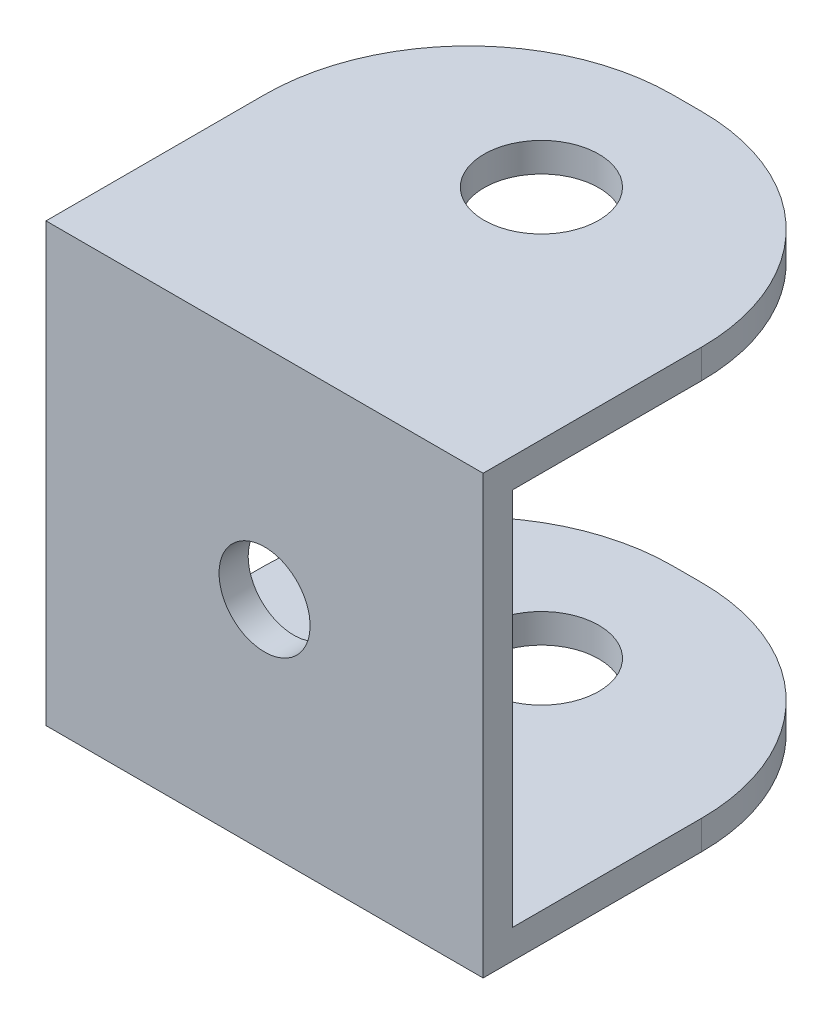
ISO-10303-21;
HEADER;
FILE_DESCRIPTION(('STEP AP214'),'2;1');
FILE_NAME('part.step','',(''),(''),'','','');
FILE_SCHEMA(('AUTOMOTIVE_DESIGN { 1 0 10303 214 1 1 1 1 }'));
ENDSEC;
DATA;
#1=APPLICATION_CONTEXT('core data for automotive mechanical design processes');
#2=APPLICATION_PROTOCOL_DEFINITION('international standard','automotive_design',2000,#1);
#3=PRODUCT_CONTEXT('',#1,'mechanical');
#4=PRODUCT('Part','Part','',(#3));
#5=PRODUCT_RELATED_PRODUCT_CATEGORY('part','',(#4));
#6=PRODUCT_DEFINITION_FORMATION('','',#4);
#7=PRODUCT_DEFINITION_CONTEXT('part definition',#1,'design');
#8=PRODUCT_DEFINITION('design','',#6,#7);
#9=PRODUCT_DEFINITION_SHAPE('','',#8);
#10=(LENGTH_UNIT() NAMED_UNIT(*) SI_UNIT(.MILLI.,.METRE.));
#11=(NAMED_UNIT(*) PLANE_ANGLE_UNIT() SI_UNIT($,.RADIAN.));
#12=(NAMED_UNIT(*) SI_UNIT($,.STERADIAN.) SOLID_ANGLE_UNIT());
#13=UNCERTAINTY_MEASURE_WITH_UNIT(LENGTH_MEASURE(1.E-05),#10,'distance_accuracy_value','');
#14=(GEOMETRIC_REPRESENTATION_CONTEXT(3) GLOBAL_UNCERTAINTY_ASSIGNED_CONTEXT((#13)) GLOBAL_UNIT_ASSIGNED_CONTEXT((#10,
#11,#12)) REPRESENTATION_CONTEXT('',''));
#15=CARTESIAN_POINT('',(0.,0.,0.));
#16=DIRECTION('',(0.,0.,1.));
#17=DIRECTION('',(1.,0.,0.));
#18=AXIS2_PLACEMENT_3D('',#15,#16,#17);
#19=CARTESIAN_POINT('',(0.,0.,0.));
#20=DIRECTION('',(0.,0.,-1.));
#21=DIRECTION('',(-1.,0.,0.));
#22=AXIS2_PLACEMENT_3D('',#19,#20,#21);
#23=PLANE('',#22);
#24=CARTESIAN_POINT('',(19.05,19.05,0.));
#25=DIRECTION('',(0.,0.,-1.));
#26=DIRECTION('',(-1.,0.,0.));
#27=AXIS2_PLACEMENT_3D('',#24,#25,#26);
#28=CIRCLE('',#27,3.96874999999999);
#29=CARTESIAN_POINT('',(15.08125,19.05,0.));
#30=VERTEX_POINT('',#29);
#31=EDGE_CURVE('E178',#30,#30,#28,.T.);
#32=ORIENTED_EDGE('',*,*,#31,.F.);
#33=EDGE_LOOP('',(#32));
#34=FACE_BOUND('',#33,.T.);
#35=DIRECTION('',(0.,1.,0.));
#36=VECTOR('',#35,1.);
#37=CARTESIAN_POINT('',(38.1,0.,0.));
#38=LINE('',#37,#36);
#39=CARTESIAN_POINT('',(38.1,2.54,0.));
#40=VERTEX_POINT('',#39);
#41=CARTESIAN_POINT('',(38.1,35.56,0.));
#42=VERTEX_POINT('',#41);
#43=EDGE_CURVE('E240',#40,#42,#38,.T.);
#44=ORIENTED_EDGE('',*,*,#43,.F.);
#45=DIRECTION('',(-1.,0.,0.));
#46=VECTOR('',#45,1.);
#47=CARTESIAN_POINT('',(0.,2.54,0.));
#48=LINE('',#47,#46);
#49=CARTESIAN_POINT('',(0.,2.54,0.));
#50=VERTEX_POINT('',#49);
#51=EDGE_CURVE('E175',#40,#50,#48,.T.);
#52=ORIENTED_EDGE('',*,*,#51,.T.);
#53=DIRECTION('',(0.,-1.,0.));
#54=VECTOR('',#53,1.);
#55=CARTESIAN_POINT('',(0.,0.,0.));
#56=LINE('',#55,#54);
#57=CARTESIAN_POINT('',(0.,35.56,0.));
#58=VERTEX_POINT('',#57);
#59=EDGE_CURVE('E143',#58,#50,#56,.T.);
#60=ORIENTED_EDGE('',*,*,#59,.F.);
#61=DIRECTION('',(1.,0.,0.));
#62=VECTOR('',#61,1.);
#63=CARTESIAN_POINT('',(0.,35.56,0.));
#64=LINE('',#63,#62);
#65=EDGE_CURVE('E11',#58,#42,#64,.T.);
#66=ORIENTED_EDGE('',*,*,#65,.T.);
#67=EDGE_LOOP('',(#44,#52,#60,#66));
#68=FACE_BOUND('',#67,.T.);
#69=ADVANCED_FACE('F45',(#34,#68),#23,.T.);
#70=CARTESIAN_POINT('',(0.,0.,2.54));
#71=DIRECTION('',(1.,0.,0.));
#72=DIRECTION('',(0.,1.,0.));
#73=AXIS2_PLACEMENT_3D('',#70,#71,#72);
#74=PLANE('',#73);
#75=DIRECTION('',(0.,0.,-1.));
#76=VECTOR('',#75,1.);
#77=CARTESIAN_POINT('',(0.,0.,2.54));
#78=LINE('',#77,#76);
#79=CARTESIAN_POINT('',(0.,0.,2.54));
#80=VERTEX_POINT('',#79);
#81=CARTESIAN_POINT('',(0.,0.,-16.5099999999999));
#82=VERTEX_POINT('',#81);
#83=EDGE_CURVE('E55',#80,#82,#78,.T.);
#84=ORIENTED_EDGE('',*,*,#83,.F.);
#85=DIRECTION('',(0.,-1.,0.));
#86=VECTOR('',#85,1.);
#87=CARTESIAN_POINT('',(0.,0.,2.54));
#88=LINE('',#87,#86);
#89=CARTESIAN_POINT('',(0.,38.1,2.54));
#90=VERTEX_POINT('',#89);
#91=EDGE_CURVE('E236',#90,#80,#88,.T.);
#92=ORIENTED_EDGE('',*,*,#91,.F.);
#93=DIRECTION('',(0.,0.,-1.));
#94=VECTOR('',#93,1.);
#95=CARTESIAN_POINT('',(0.,38.1,2.54));
#96=LINE('',#95,#94);
#97=CARTESIAN_POINT('',(0.,38.1,-16.5099999999999));
#98=VERTEX_POINT('',#97);
#99=EDGE_CURVE('E247',#90,#98,#96,.T.);
#100=ORIENTED_EDGE('',*,*,#99,.T.);
#101=DIRECTION('',(0.,1.,0.));
#102=VECTOR('',#101,1.);
#103=CARTESIAN_POINT('',(0.,35.56,-16.5099999999999));
#104=LINE('',#103,#102);
#105=CARTESIAN_POINT('',(0.,35.56,-16.5099999999999));
#106=VERTEX_POINT('',#105);
#107=EDGE_CURVE('E223',#106,#98,#104,.T.);
#108=ORIENTED_EDGE('',*,*,#107,.F.);
#109=DIRECTION('',(0.,0.,1.));
#110=VECTOR('',#109,1.);
#111=CARTESIAN_POINT('',(0.,35.56,0.));
#112=LINE('',#111,#110);
#113=EDGE_CURVE('E192',#106,#58,#112,.T.);
#114=ORIENTED_EDGE('',*,*,#113,.T.);
#115=ORIENTED_EDGE('',*,*,#59,.T.);
#116=DIRECTION('',(0.,0.,1.));
#117=VECTOR('',#116,1.);
#118=CARTESIAN_POINT('',(0.,2.54,0.));
#119=LINE('',#118,#117);
#120=CARTESIAN_POINT('',(0.,2.54,-16.5099999999999));
#121=VERTEX_POINT('',#120);
#122=EDGE_CURVE('E136',#121,#50,#119,.T.);
#123=ORIENTED_EDGE('',*,*,#122,.F.);
#124=DIRECTION('',(0.,-1.,0.));
#125=VECTOR('',#124,1.);
#126=CARTESIAN_POINT('',(0.,2.54,-16.5099999999999));
#127=LINE('',#126,#125);
#128=EDGE_CURVE('E140',#121,#82,#127,.T.);
#129=ORIENTED_EDGE('',*,*,#128,.T.);
#130=EDGE_LOOP('',(#84,#92,#100,#108,#114,#115,#123,#129));
#131=FACE_BOUND('',#130,.T.);
#132=ADVANCED_FACE('F47',(#131),#74,.F.);
#133=CARTESIAN_POINT('',(0.,0.,2.54));
#134=DIRECTION('',(0.,1.,0.));
#135=DIRECTION('',(0.,0.,1.));
#136=AXIS2_PLACEMENT_3D('',#133,#134,#135);
#137=PLANE('',#136);
#138=CARTESIAN_POINT('',(19.05,0.,-21.59));
#139=DIRECTION('',(0.,-1.,0.));
#140=DIRECTION('',(0.,0.,-1.));
#141=AXIS2_PLACEMENT_3D('',#138,#139,#140);
#142=CIRCLE('',#141,5.);
#143=CARTESIAN_POINT('',(19.05,0.,-26.59));
#144=VERTEX_POINT('',#143);
#145=EDGE_CURVE('E309',#144,#144,#142,.T.);
#146=ORIENTED_EDGE('',*,*,#145,.F.);
#147=EDGE_LOOP('',(#146));
#148=FACE_BOUND('',#147,.T.);
#149=ORIENTED_EDGE('',*,*,#83,.T.);
#150=CARTESIAN_POINT('',(17.78,0.,-16.51));
#151=DIRECTION('',(0.,1.,0.));
#152=DIRECTION('',(0.,0.,-1.));
#153=AXIS2_PLACEMENT_3D('',#150,#151,#152);
#154=CIRCLE('',#153,17.78);
#155=CARTESIAN_POINT('',(17.78,0.,-34.29));
#156=VERTEX_POINT('',#155);
#157=EDGE_CURVE('E162',#156,#82,#154,.T.);
#158=ORIENTED_EDGE('',*,*,#157,.F.);
#159=DIRECTION('',(-1.,0.,0.));
#160=VECTOR('',#159,1.);
#161=CARTESIAN_POINT('',(20.3199999999999,0.,-34.29));
#162=LINE('',#161,#160);
#163=CARTESIAN_POINT('',(20.3199999999999,0.,-34.29));
#164=VERTEX_POINT('',#163);
#165=EDGE_CURVE('E343',#164,#156,#162,.T.);
#166=ORIENTED_EDGE('',*,*,#165,.F.);
#167=CARTESIAN_POINT('',(20.32,0.,-16.51));
#168=DIRECTION('',(0.,1.,0.));
#169=DIRECTION('',(0.,0.,1.));
#170=AXIS2_PLACEMENT_3D('',#167,#168,#169);
#171=CIRCLE('',#170,17.78);
#172=CARTESIAN_POINT('',(38.1,0.,-16.5099999999999));
#173=VERTEX_POINT('',#172);
#174=EDGE_CURVE('E148',#173,#164,#171,.T.);
#175=ORIENTED_EDGE('',*,*,#174,.F.);
#176=DIRECTION('',(0.,0.,-1.));
#177=VECTOR('',#176,1.);
#178=CARTESIAN_POINT('',(38.1,0.,2.54));
#179=LINE('',#178,#177);
#180=CARTESIAN_POINT('',(38.1,0.,2.54));
#181=VERTEX_POINT('',#180);
#182=EDGE_CURVE('E257',#181,#173,#179,.T.);
#183=ORIENTED_EDGE('',*,*,#182,.F.);
#184=DIRECTION('',(1.,0.,0.));
#185=VECTOR('',#184,1.);
#186=CARTESIAN_POINT('',(0.,0.,2.54));
#187=LINE('',#186,#185);
#188=EDGE_CURVE('E239',#80,#181,#187,.T.);
#189=ORIENTED_EDGE('',*,*,#188,.F.);
#190=EDGE_LOOP('',(#149,#158,#166,#175,#183,#189));
#191=FACE_BOUND('',#190,.T.);
#192=ADVANCED_FACE('F288',(#148,#191),#137,.F.);
#193=CARTESIAN_POINT('',(38.1,0.,2.54));
#194=DIRECTION('',(-1.,0.,0.));
#195=DIRECTION('',(0.,-1.,0.));
#196=AXIS2_PLACEMENT_3D('',#193,#194,#195);
#197=PLANE('',#196);
#198=ORIENTED_EDGE('',*,*,#182,.T.);
#199=DIRECTION('',(0.,-1.,0.));
#200=VECTOR('',#199,1.);
#201=CARTESIAN_POINT('',(38.1,2.54,-16.5099999999999));
#202=LINE('',#201,#200);
#203=CARTESIAN_POINT('',(38.1,2.54,-16.5099999999999));
#204=VERTEX_POINT('',#203);
#205=EDGE_CURVE('E179',#204,#173,#202,.T.);
#206=ORIENTED_EDGE('',*,*,#205,.F.);
#207=DIRECTION('',(0.,0.,-1.));
#208=VECTOR('',#207,1.);
#209=CARTESIAN_POINT('',(38.1,2.54,0.));
#210=LINE('',#209,#208);
#211=EDGE_CURVE('E165',#40,#204,#210,.T.);
#212=ORIENTED_EDGE('',*,*,#211,.F.);
#213=ORIENTED_EDGE('',*,*,#43,.T.);
#214=DIRECTION('',(0.,0.,-1.));
#215=VECTOR('',#214,1.);
#216=CARTESIAN_POINT('',(38.1,35.56,2.54));
#217=LINE('',#216,#215);
#218=CARTESIAN_POINT('',(38.1,35.56,-16.5099999999999));
#219=VERTEX_POINT('',#218);
#220=EDGE_CURVE('E195',#42,#219,#217,.T.);
#221=ORIENTED_EDGE('',*,*,#220,.T.);
#222=DIRECTION('',(0.,1.,0.));
#223=VECTOR('',#222,1.);
#224=CARTESIAN_POINT('',(38.1,35.56,-16.5099999999999));
#225=LINE('',#224,#223);
#226=CARTESIAN_POINT('',(38.1,38.1,-16.5099999999999));
#227=VERTEX_POINT('',#226);
#228=EDGE_CURVE('E211',#219,#227,#225,.T.);
#229=ORIENTED_EDGE('',*,*,#228,.T.);
#230=DIRECTION('',(0.,0.,-1.));
#231=VECTOR('',#230,1.);
#232=CARTESIAN_POINT('',(38.1,38.1,2.54));
#233=LINE('',#232,#231);
#234=CARTESIAN_POINT('',(38.1,38.1,2.54));
#235=VERTEX_POINT('',#234);
#236=EDGE_CURVE('E254',#235,#227,#233,.T.);
#237=ORIENTED_EDGE('',*,*,#236,.F.);
#238=DIRECTION('',(0.,1.,0.));
#239=VECTOR('',#238,1.);
#240=CARTESIAN_POINT('',(38.1,0.,2.54));
#241=LINE('',#240,#239);
#242=EDGE_CURVE('E68',#181,#235,#241,.T.);
#243=ORIENTED_EDGE('',*,*,#242,.F.);
#244=EDGE_LOOP('',(#198,#206,#212,#213,#221,#229,#237,#243));
#245=FACE_BOUND('',#244,.T.);
#246=ADVANCED_FACE('F298',(#245),#197,.F.);
#247=CARTESIAN_POINT('',(0.,38.1,2.54));
#248=DIRECTION('',(0.,-1.,0.));
#249=DIRECTION('',(0.,0.,-1.));
#250=AXIS2_PLACEMENT_3D('',#247,#248,#249);
#251=PLANE('',#250);
#252=CARTESIAN_POINT('',(19.05,38.1,-21.59));
#253=DIRECTION('',(0.,1.,0.));
#254=DIRECTION('',(0.,0.,1.));
#255=AXIS2_PLACEMENT_3D('',#252,#253,#254);
#256=CIRCLE('',#255,5.);
#257=CARTESIAN_POINT('',(19.05,38.1,-16.59));
#258=VERTEX_POINT('',#257);
#259=EDGE_CURVE('E187',#258,#258,#256,.T.);
#260=ORIENTED_EDGE('',*,*,#259,.F.);
#261=EDGE_LOOP('',(#260));
#262=FACE_BOUND('',#261,.T.);
#263=CARTESIAN_POINT('',(17.78,38.1,-16.51));
#264=DIRECTION('',(0.,1.,0.));
#265=DIRECTION('',(0.,0.,-1.));
#266=AXIS2_PLACEMENT_3D('',#263,#264,#265);
#267=CIRCLE('',#266,17.78);
#268=CARTESIAN_POINT('',(17.78,38.1,-34.29));
#269=VERTEX_POINT('',#268);
#270=EDGE_CURVE('E196',#269,#98,#267,.T.);
#271=ORIENTED_EDGE('',*,*,#270,.T.);
#272=ORIENTED_EDGE('',*,*,#99,.F.);
#273=DIRECTION('',(-1.,0.,0.));
#274=VECTOR('',#273,1.);
#275=CARTESIAN_POINT('',(0.,38.1,2.54));
#276=LINE('',#275,#274);
#277=EDGE_CURVE('E63',#235,#90,#276,.T.);
#278=ORIENTED_EDGE('',*,*,#277,.F.);
#279=ORIENTED_EDGE('',*,*,#236,.T.);
#280=CARTESIAN_POINT('',(20.32,38.1,-16.51));
#281=DIRECTION('',(0.,1.,0.));
#282=DIRECTION('',(0.,0.,1.));
#283=AXIS2_PLACEMENT_3D('',#280,#281,#282);
#284=CIRCLE('',#283,17.78);
#285=CARTESIAN_POINT('',(20.3199999999999,38.1,-34.29));
#286=VERTEX_POINT('',#285);
#287=EDGE_CURVE('E212',#227,#286,#284,.T.);
#288=ORIENTED_EDGE('',*,*,#287,.T.);
#289=DIRECTION('',(-1.,0.,0.));
#290=VECTOR('',#289,1.);
#291=CARTESIAN_POINT('',(20.3199999999999,38.1,-34.29));
#292=LINE('',#291,#290);
#293=EDGE_CURVE('E216',#286,#269,#292,.T.);
#294=ORIENTED_EDGE('',*,*,#293,.T.);
#295=EDGE_LOOP('',(#271,#272,#278,#279,#288,#294));
#296=FACE_BOUND('',#295,.T.);
#297=ADVANCED_FACE('F295',(#262,#296),#251,.F.);
#298=CARTESIAN_POINT('',(0.,0.,2.54));
#299=DIRECTION('',(0.,0.,-1.));
#300=DIRECTION('',(-1.,0.,0.));
#301=AXIS2_PLACEMENT_3D('',#298,#299,#300);
#302=PLANE('',#301);
#303=ORIENTED_EDGE('',*,*,#242,.T.);
#304=ORIENTED_EDGE('',*,*,#277,.T.);
#305=ORIENTED_EDGE('',*,*,#91,.T.);
#306=ORIENTED_EDGE('',*,*,#188,.T.);
#307=EDGE_LOOP('',(#303,#304,#305,#306));
#308=FACE_BOUND('',#307,.T.);
#309=CARTESIAN_POINT('',(19.05,19.05,2.54));
#310=DIRECTION('',(0.,0.,-1.));
#311=DIRECTION('',(-1.,0.,0.));
#312=AXIS2_PLACEMENT_3D('',#309,#310,#311);
#313=CIRCLE('',#312,3.96875);
#314=CARTESIAN_POINT('',(15.08125,19.05,2.54));
#315=VERTEX_POINT('',#314);
#316=EDGE_CURVE('E183',#315,#315,#313,.T.);
#317=ORIENTED_EDGE('',*,*,#316,.T.);
#318=EDGE_LOOP('',(#317));
#319=FACE_BOUND('',#318,.T.);
#320=ADVANCED_FACE('F293',(#308,#319),#302,.F.);
#321=CARTESIAN_POINT('',(17.78,35.56,-16.51));
#322=DIRECTION('',(0.,1.,0.));
#323=DIRECTION('',(0.,0.,1.));
#324=AXIS2_PLACEMENT_3D('',#321,#322,#323);
#325=CYLINDRICAL_SURFACE('',#324,17.78);
#326=ORIENTED_EDGE('',*,*,#270,.F.);
#327=DIRECTION('',(0.,1.,0.));
#328=VECTOR('',#327,1.);
#329=CARTESIAN_POINT('',(17.78,35.56,-34.29));
#330=LINE('',#329,#328);
#331=CARTESIAN_POINT('',(17.78,35.56,-34.29));
#332=VERTEX_POINT('',#331);
#333=EDGE_CURVE('E227',#332,#269,#330,.T.);
#334=ORIENTED_EDGE('',*,*,#333,.F.);
#335=CARTESIAN_POINT('',(17.78,35.56,-16.51));
#336=DIRECTION('',(0.,1.,0.));
#337=DIRECTION('',(0.,0.,-1.));
#338=AXIS2_PLACEMENT_3D('',#335,#336,#337);
#339=CIRCLE('',#338,17.78);
#340=EDGE_CURVE('E207',#332,#106,#339,.T.);
#341=ORIENTED_EDGE('',*,*,#340,.T.);
#342=ORIENTED_EDGE('',*,*,#107,.T.);
#343=EDGE_LOOP('',(#326,#334,#341,#342));
#344=FACE_BOUND('',#343,.T.);
#345=ADVANCED_FACE('F325',(#344),#325,.T.);
#346=CARTESIAN_POINT('',(20.3199999999999,35.56,-34.29));
#347=DIRECTION('',(0.,0.,-1.));
#348=DIRECTION('',(-1.,0.,0.));
#349=AXIS2_PLACEMENT_3D('',#346,#347,#348);
#350=PLANE('',#349);
#351=ORIENTED_EDGE('',*,*,#293,.F.);
#352=DIRECTION('',(0.,1.,0.));
#353=VECTOR('',#352,1.);
#354=CARTESIAN_POINT('',(20.3199999999999,35.56,-34.29));
#355=LINE('',#354,#353);
#356=CARTESIAN_POINT('',(20.3199999999999,35.56,-34.29));
#357=VERTEX_POINT('',#356);
#358=EDGE_CURVE('E230',#357,#286,#355,.T.);
#359=ORIENTED_EDGE('',*,*,#358,.F.);
#360=DIRECTION('',(-1.,0.,0.));
#361=VECTOR('',#360,1.);
#362=CARTESIAN_POINT('',(20.3199999999999,35.56,-34.29));
#363=LINE('',#362,#361);
#364=EDGE_CURVE('E203',#357,#332,#363,.T.);
#365=ORIENTED_EDGE('',*,*,#364,.T.);
#366=ORIENTED_EDGE('',*,*,#333,.T.);
#367=EDGE_LOOP('',(#351,#359,#365,#366));
#368=FACE_BOUND('',#367,.T.);
#369=ADVANCED_FACE('F418',(#368),#350,.T.);
#370=CARTESIAN_POINT('',(20.32,35.56,-16.51));
#371=DIRECTION('',(0.,1.,0.));
#372=DIRECTION('',(0.,0.,1.));
#373=AXIS2_PLACEMENT_3D('',#370,#371,#372);
#374=CYLINDRICAL_SURFACE('',#373,17.78);
#375=ORIENTED_EDGE('',*,*,#287,.F.);
#376=ORIENTED_EDGE('',*,*,#228,.F.);
#377=CARTESIAN_POINT('',(20.32,35.56,-16.51));
#378=DIRECTION('',(0.,1.,0.));
#379=DIRECTION('',(0.,0.,1.));
#380=AXIS2_PLACEMENT_3D('',#377,#378,#379);
#381=CIRCLE('',#380,17.78);
#382=EDGE_CURVE('E199',#219,#357,#381,.T.);
#383=ORIENTED_EDGE('',*,*,#382,.T.);
#384=ORIENTED_EDGE('',*,*,#358,.T.);
#385=EDGE_LOOP('',(#375,#376,#383,#384));
#386=FACE_BOUND('',#385,.T.);
#387=ADVANCED_FACE('F280',(#386),#374,.T.);
#388=CARTESIAN_POINT('',(20.32,35.56,-16.51));
#389=DIRECTION('',(0.,1.,0.));
#390=DIRECTION('',(0.,0.,1.));
#391=AXIS2_PLACEMENT_3D('',#388,#389,#390);
#392=PLANE('',#391);
#393=CARTESIAN_POINT('',(19.05,35.56,-21.59));
#394=DIRECTION('',(0.,1.,0.));
#395=DIRECTION('',(0.,0.,1.));
#396=AXIS2_PLACEMENT_3D('',#393,#394,#395);
#397=CIRCLE('',#396,5.);
#398=CARTESIAN_POINT('',(19.05,35.56,-16.59));
#399=VERTEX_POINT('',#398);
#400=EDGE_CURVE('E191',#399,#399,#397,.T.);
#401=ORIENTED_EDGE('',*,*,#400,.T.);
#402=EDGE_LOOP('',(#401));
#403=FACE_BOUND('',#402,.T.);
#404=ORIENTED_EDGE('',*,*,#65,.F.);
#405=ORIENTED_EDGE('',*,*,#113,.F.);
#406=ORIENTED_EDGE('',*,*,#340,.F.);
#407=ORIENTED_EDGE('',*,*,#364,.F.);
#408=ORIENTED_EDGE('',*,*,#382,.F.);
#409=ORIENTED_EDGE('',*,*,#220,.F.);
#410=EDGE_LOOP('',(#404,#405,#406,#407,#408,#409));
#411=FACE_BOUND('',#410,.T.);
#412=ADVANCED_FACE('F265',(#403,#411),#392,.F.);
#413=CARTESIAN_POINT('',(19.05,38.1,-21.59));
#414=DIRECTION('',(0.,1.,0.));
#415=DIRECTION('',(0.,0.,1.));
#416=AXIS2_PLACEMENT_3D('',#413,#414,#415);
#417=CYLINDRICAL_SURFACE('',#416,5.);
#418=ORIENTED_EDGE('',*,*,#259,.T.);
#419=EDGE_LOOP('',(#418));
#420=FACE_BOUND('',#419,.T.);
#421=ORIENTED_EDGE('',*,*,#400,.F.);
#422=EDGE_LOOP('',(#421));
#423=FACE_BOUND('',#422,.T.);
#424=ADVANCED_FACE('F268',(#420,#423),#417,.F.);
#425=CARTESIAN_POINT('',(19.05,19.05,0.));
#426=DIRECTION('',(0.,0.,-1.));
#427=DIRECTION('',(-1.,0.,0.));
#428=AXIS2_PLACEMENT_3D('',#425,#426,#427);
#429=CYLINDRICAL_SURFACE('',#428,3.96874999999999);
#430=ORIENTED_EDGE('',*,*,#316,.F.);
#431=EDGE_LOOP('',(#430));
#432=FACE_BOUND('',#431,.T.);
#433=ORIENTED_EDGE('',*,*,#31,.T.);
#434=EDGE_LOOP('',(#433));
#435=FACE_BOUND('',#434,.T.);
#436=ADVANCED_FACE('F270',(#432,#435),#429,.F.);
#437=CARTESIAN_POINT('',(20.32,2.54,-16.51));
#438=DIRECTION('',(0.,-1.,0.));
#439=DIRECTION('',(0.,0.,-1.));
#440=AXIS2_PLACEMENT_3D('',#437,#438,#439);
#441=CYLINDRICAL_SURFACE('',#440,17.78);
#442=ORIENTED_EDGE('',*,*,#174,.T.);
#443=DIRECTION('',(0.,-1.,0.));
#444=VECTOR('',#443,1.);
#445=CARTESIAN_POINT('',(20.3199999999999,2.54,-34.29));
#446=LINE('',#445,#444);
#447=CARTESIAN_POINT('',(20.3199999999999,2.54,-34.29));
#448=VERTEX_POINT('',#447);
#449=EDGE_CURVE('E169',#448,#164,#446,.T.);
#450=ORIENTED_EDGE('',*,*,#449,.F.);
#451=CARTESIAN_POINT('',(20.32,2.54,-16.51));
#452=DIRECTION('',(0.,1.,0.));
#453=DIRECTION('',(0.,0.,1.));
#454=AXIS2_PLACEMENT_3D('',#451,#452,#453);
#455=CIRCLE('',#454,17.78);
#456=EDGE_CURVE('E171',#204,#448,#455,.T.);
#457=ORIENTED_EDGE('',*,*,#456,.F.);
#458=ORIENTED_EDGE('',*,*,#205,.T.);
#459=EDGE_LOOP('',(#442,#450,#457,#458));
#460=FACE_BOUND('',#459,.T.);
#461=ADVANCED_FACE('F277',(#460),#441,.T.);
#462=CARTESIAN_POINT('',(20.3199999999999,2.54,-34.29));
#463=DIRECTION('',(0.,0.,1.));
#464=DIRECTION('',(1.,0.,0.));
#465=AXIS2_PLACEMENT_3D('',#462,#463,#464);
#466=PLANE('',#465);
#467=ORIENTED_EDGE('',*,*,#165,.T.);
#468=DIRECTION('',(0.,-1.,0.));
#469=VECTOR('',#468,1.);
#470=CARTESIAN_POINT('',(17.78,2.54,-34.29));
#471=LINE('',#470,#469);
#472=CARTESIAN_POINT('',(17.78,2.54,-34.29));
#473=VERTEX_POINT('',#472);
#474=EDGE_CURVE('E164',#473,#156,#471,.T.);
#475=ORIENTED_EDGE('',*,*,#474,.F.);
#476=DIRECTION('',(-1.,0.,0.));
#477=VECTOR('',#476,1.);
#478=CARTESIAN_POINT('',(20.3199999999999,2.54,-34.29));
#479=LINE('',#478,#477);
#480=EDGE_CURVE('E153',#448,#473,#479,.T.);
#481=ORIENTED_EDGE('',*,*,#480,.F.);
#482=ORIENTED_EDGE('',*,*,#449,.T.);
#483=EDGE_LOOP('',(#467,#475,#481,#482));
#484=FACE_BOUND('',#483,.T.);
#485=ADVANCED_FACE('F349',(#484),#466,.F.);
#486=CARTESIAN_POINT('',(17.78,2.54,-16.51));
#487=DIRECTION('',(0.,-1.,0.));
#488=DIRECTION('',(0.,0.,-1.));
#489=AXIS2_PLACEMENT_3D('',#486,#487,#488);
#490=CYLINDRICAL_SURFACE('',#489,17.78);
#491=ORIENTED_EDGE('',*,*,#157,.T.);
#492=ORIENTED_EDGE('',*,*,#128,.F.);
#493=CARTESIAN_POINT('',(17.78,2.54,-16.51));
#494=DIRECTION('',(0.,1.,0.));
#495=DIRECTION('',(0.,0.,-1.));
#496=AXIS2_PLACEMENT_3D('',#493,#494,#495);
#497=CIRCLE('',#496,17.78);
#498=EDGE_CURVE('E147',#473,#121,#497,.T.);
#499=ORIENTED_EDGE('',*,*,#498,.F.);
#500=ORIENTED_EDGE('',*,*,#474,.T.);
#501=EDGE_LOOP('',(#491,#492,#499,#500));
#502=FACE_BOUND('',#501,.T.);
#503=ADVANCED_FACE('F160',(#502),#490,.T.);
#504=CARTESIAN_POINT('',(20.32,2.54,-16.51));
#505=DIRECTION('',(0.,-1.,0.));
#506=DIRECTION('',(0.,0.,1.));
#507=AXIS2_PLACEMENT_3D('',#504,#505,#506);
#508=PLANE('',#507);
#509=CARTESIAN_POINT('',(19.05,2.54,-21.59));
#510=DIRECTION('',(0.,-1.,0.));
#511=DIRECTION('',(0.,0.,-1.));
#512=AXIS2_PLACEMENT_3D('',#509,#510,#511);
#513=CIRCLE('',#512,5.);
#514=CARTESIAN_POINT('',(19.05,2.54,-26.59));
#515=VERTEX_POINT('',#514);
#516=EDGE_CURVE('E49',#515,#515,#513,.T.);
#517=ORIENTED_EDGE('',*,*,#516,.T.);
#518=EDGE_LOOP('',(#517));
#519=FACE_BOUND('',#518,.T.);
#520=ORIENTED_EDGE('',*,*,#51,.F.);
#521=ORIENTED_EDGE('',*,*,#211,.T.);
#522=ORIENTED_EDGE('',*,*,#456,.T.);
#523=ORIENTED_EDGE('',*,*,#480,.T.);
#524=ORIENTED_EDGE('',*,*,#498,.T.);
#525=ORIENTED_EDGE('',*,*,#122,.T.);
#526=EDGE_LOOP('',(#520,#521,#522,#523,#524,#525));
#527=FACE_BOUND('',#526,.T.);
#528=ADVANCED_FACE('F151',(#519,#527),#508,.F.);
#529=CARTESIAN_POINT('',(19.05,0.,-21.59));
#530=DIRECTION('',(0.,-1.,0.));
#531=DIRECTION('',(0.,0.,-1.));
#532=AXIS2_PLACEMENT_3D('',#529,#530,#531);
#533=CYLINDRICAL_SURFACE('',#532,5.);
#534=ORIENTED_EDGE('',*,*,#145,.T.);
#535=EDGE_LOOP('',(#534));
#536=FACE_BOUND('',#535,.T.);
#537=ORIENTED_EDGE('',*,*,#516,.F.);
#538=EDGE_LOOP('',(#537));
#539=FACE_BOUND('',#538,.T.);
#540=ADVANCED_FACE('F361',(#536,#539),#533,.F.);
#541=CLOSED_SHELL('',(#69,#132,#192,#246,#297,#320,#345,#369,#387,#412,#424,#436,#461,#485,#503,
#528,#540));
#542=MANIFOLD_SOLID_BREP('B2',#541);
#543=ADVANCED_BREP_SHAPE_REPRESENTATION('',(#18,#542),#14);
#544=SHAPE_DEFINITION_REPRESENTATION(#9,#543);
ENDSEC;
END-ISO-10303-21;
